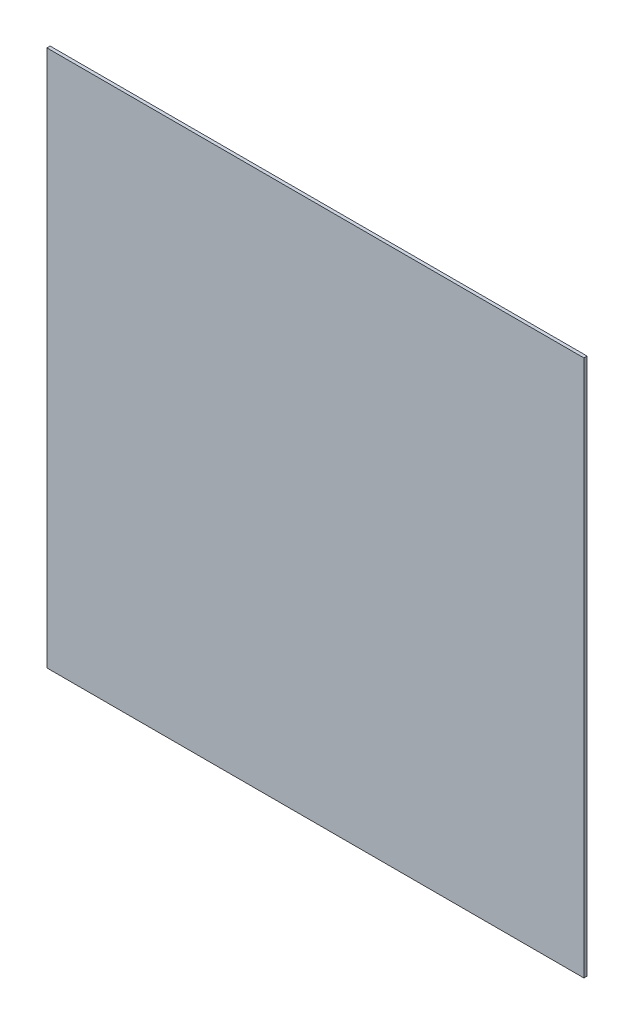
ISO-10303-21;
HEADER;
FILE_DESCRIPTION(('STEP AP214'),'2;1');
FILE_NAME('part.step','',(''),(''),'','','');
FILE_SCHEMA(('AUTOMOTIVE_DESIGN { 1 0 10303 214 1 1 1 1 }'));
ENDSEC;
DATA;
#1=APPLICATION_CONTEXT('core data for automotive mechanical design processes');
#2=APPLICATION_PROTOCOL_DEFINITION('international standard','automotive_design',2000,#1);
#3=PRODUCT_CONTEXT('',#1,'mechanical');
#4=PRODUCT('Part','Part','',(#3));
#5=PRODUCT_RELATED_PRODUCT_CATEGORY('part','',(#4));
#6=PRODUCT_DEFINITION_FORMATION('','',#4);
#7=PRODUCT_DEFINITION_CONTEXT('part definition',#1,'design');
#8=PRODUCT_DEFINITION('design','',#6,#7);
#9=PRODUCT_DEFINITION_SHAPE('','',#8);
#10=(LENGTH_UNIT() NAMED_UNIT(*) SI_UNIT(.MILLI.,.METRE.));
#11=(NAMED_UNIT(*) PLANE_ANGLE_UNIT() SI_UNIT($,.RADIAN.));
#12=(NAMED_UNIT(*) SI_UNIT($,.STERADIAN.) SOLID_ANGLE_UNIT());
#13=UNCERTAINTY_MEASURE_WITH_UNIT(LENGTH_MEASURE(1.E-05),#10,'distance_accuracy_value','');
#14=(GEOMETRIC_REPRESENTATION_CONTEXT(3) GLOBAL_UNCERTAINTY_ASSIGNED_CONTEXT((#13)) GLOBAL_UNIT_ASSIGNED_CONTEXT((#10,
#11,#12)) REPRESENTATION_CONTEXT('',''));
#15=CARTESIAN_POINT('',(0.,0.,0.));
#16=DIRECTION('',(0.,0.,1.));
#17=DIRECTION('',(1.,0.,0.));
#18=AXIS2_PLACEMENT_3D('',#15,#16,#17);
#19=CARTESIAN_POINT('',(0.,0.,0.762));
#20=DIRECTION('',(1.,0.,0.));
#21=DIRECTION('',(0.,0.,-1.));
#22=AXIS2_PLACEMENT_3D('',#19,#20,#21);
#23=PLANE('',#22);
#24=DIRECTION('',(0.,-1.,0.));
#25=VECTOR('',#24,1.);
#26=CARTESIAN_POINT('',(0.,0.,0.));
#27=LINE('',#26,#25);
#28=CARTESIAN_POINT('',(0.,127.,0.));
#29=VERTEX_POINT('',#28);
#30=CARTESIAN_POINT('',(0.,0.,0.));
#31=VERTEX_POINT('',#30);
#32=EDGE_CURVE('E113',#29,#31,#27,.T.);
#33=ORIENTED_EDGE('',*,*,#32,.T.);
#34=DIRECTION('',(0.,0.,-1.));
#35=VECTOR('',#34,1.);
#36=CARTESIAN_POINT('',(0.,0.,0.762));
#37=LINE('',#36,#35);
#38=CARTESIAN_POINT('',(0.,0.,0.762));
#39=VERTEX_POINT('',#38);
#40=EDGE_CURVE('E11',#39,#31,#37,.T.);
#41=ORIENTED_EDGE('',*,*,#40,.F.);
#42=DIRECTION('',(0.,-1.,0.));
#43=VECTOR('',#42,1.);
#44=CARTESIAN_POINT('',(0.,0.,0.762));
#45=LINE('',#44,#43);
#46=CARTESIAN_POINT('',(0.,127.,0.762));
#47=VERTEX_POINT('',#46);
#48=EDGE_CURVE('E97',#47,#39,#45,.T.);
#49=ORIENTED_EDGE('',*,*,#48,.F.);
#50=DIRECTION('',(0.,0.,-1.));
#51=VECTOR('',#50,1.);
#52=CARTESIAN_POINT('',(0.,127.,0.762));
#53=LINE('',#52,#51);
#54=EDGE_CURVE('E109',#47,#29,#53,.T.);
#55=ORIENTED_EDGE('',*,*,#54,.T.);
#56=EDGE_LOOP('',(#33,#41,#49,#55));
#57=FACE_BOUND('',#56,.T.);
#58=ADVANCED_FACE('F45',(#57),#23,.F.);
#59=CARTESIAN_POINT('',(0.,0.,0.762));
#60=DIRECTION('',(0.,1.,0.));
#61=DIRECTION('',(0.,0.,1.));
#62=AXIS2_PLACEMENT_3D('',#59,#60,#61);
#63=PLANE('',#62);
#64=DIRECTION('',(1.,0.,0.));
#65=VECTOR('',#64,1.);
#66=CARTESIAN_POINT('',(0.,0.,0.));
#67=LINE('',#66,#65);
#68=CARTESIAN_POINT('',(127.,0.,0.));
#69=VERTEX_POINT('',#68);
#70=EDGE_CURVE('E102',#31,#69,#67,.T.);
#71=ORIENTED_EDGE('',*,*,#70,.T.);
#72=DIRECTION('',(0.,0.,-1.));
#73=VECTOR('',#72,1.);
#74=CARTESIAN_POINT('',(127.,0.,0.762));
#75=LINE('',#74,#73);
#76=CARTESIAN_POINT('',(127.,0.,0.762));
#77=VERTEX_POINT('',#76);
#78=EDGE_CURVE('E54',#77,#69,#75,.T.);
#79=ORIENTED_EDGE('',*,*,#78,.F.);
#80=DIRECTION('',(1.,0.,0.));
#81=VECTOR('',#80,1.);
#82=CARTESIAN_POINT('',(0.,0.,0.762));
#83=LINE('',#82,#81);
#84=EDGE_CURVE('E92',#39,#77,#83,.T.);
#85=ORIENTED_EDGE('',*,*,#84,.F.);
#86=ORIENTED_EDGE('',*,*,#40,.T.);
#87=EDGE_LOOP('',(#71,#79,#85,#86));
#88=FACE_BOUND('',#87,.T.);
#89=ADVANCED_FACE('F101',(#88),#63,.F.);
#90=CARTESIAN_POINT('',(127.,0.,0.762));
#91=DIRECTION('',(-1.,0.,0.));
#92=DIRECTION('',(0.,0.,1.));
#93=AXIS2_PLACEMENT_3D('',#90,#91,#92);
#94=PLANE('',#93);
#95=DIRECTION('',(0.,1.,0.));
#96=VECTOR('',#95,1.);
#97=CARTESIAN_POINT('',(127.,0.,0.));
#98=LINE('',#97,#96);
#99=CARTESIAN_POINT('',(127.,127.,0.));
#100=VERTEX_POINT('',#99);
#101=EDGE_CURVE('E79',#69,#100,#98,.T.);
#102=ORIENTED_EDGE('',*,*,#101,.T.);
#103=DIRECTION('',(0.,0.,-1.));
#104=VECTOR('',#103,1.);
#105=CARTESIAN_POINT('',(127.,127.,0.762));
#106=LINE('',#105,#104);
#107=CARTESIAN_POINT('',(127.,127.,0.762));
#108=VERTEX_POINT('',#107);
#109=EDGE_CURVE('E104',#108,#100,#106,.T.);
#110=ORIENTED_EDGE('',*,*,#109,.F.);
#111=DIRECTION('',(0.,1.,0.));
#112=VECTOR('',#111,1.);
#113=CARTESIAN_POINT('',(127.,0.,0.762));
#114=LINE('',#113,#112);
#115=EDGE_CURVE('E95',#77,#108,#114,.T.);
#116=ORIENTED_EDGE('',*,*,#115,.F.);
#117=ORIENTED_EDGE('',*,*,#78,.T.);
#118=EDGE_LOOP('',(#102,#110,#116,#117));
#119=FACE_BOUND('',#118,.T.);
#120=ADVANCED_FACE('F105',(#119),#94,.F.);
#121=CARTESIAN_POINT('',(0.,127.,0.762));
#122=DIRECTION('',(0.,-1.,0.));
#123=DIRECTION('',(0.,0.,-1.));
#124=AXIS2_PLACEMENT_3D('',#121,#122,#123);
#125=PLANE('',#124);
#126=DIRECTION('',(-1.,0.,0.));
#127=VECTOR('',#126,1.);
#128=CARTESIAN_POINT('',(0.,127.,0.));
#129=LINE('',#128,#127);
#130=EDGE_CURVE('E85',#100,#29,#129,.T.);
#131=ORIENTED_EDGE('',*,*,#130,.T.);
#132=ORIENTED_EDGE('',*,*,#54,.F.);
#133=DIRECTION('',(-1.,0.,0.));
#134=VECTOR('',#133,1.);
#135=CARTESIAN_POINT('',(0.,127.,0.762));
#136=LINE('',#135,#134);
#137=EDGE_CURVE('E62',#108,#47,#136,.T.);
#138=ORIENTED_EDGE('',*,*,#137,.F.);
#139=ORIENTED_EDGE('',*,*,#109,.T.);
#140=EDGE_LOOP('',(#131,#132,#138,#139));
#141=FACE_BOUND('',#140,.T.);
#142=ADVANCED_FACE('F126',(#141),#125,.F.);
#143=CARTESIAN_POINT('',(0.,0.,0.762));
#144=DIRECTION('',(0.,0.,-1.));
#145=DIRECTION('',(-1.,0.,0.));
#146=AXIS2_PLACEMENT_3D('',#143,#144,#145);
#147=PLANE('',#146);
#148=ORIENTED_EDGE('',*,*,#48,.T.);
#149=ORIENTED_EDGE('',*,*,#84,.T.);
#150=ORIENTED_EDGE('',*,*,#115,.T.);
#151=ORIENTED_EDGE('',*,*,#137,.T.);
#152=EDGE_LOOP('',(#148,#149,#150,#151));
#153=FACE_BOUND('',#152,.T.);
#154=ADVANCED_FACE('F93',(#153),#147,.F.);
#155=CARTESIAN_POINT('',(0.,0.,0.));
#156=DIRECTION('',(0.,0.,-1.));
#157=DIRECTION('',(-1.,0.,0.));
#158=AXIS2_PLACEMENT_3D('',#155,#156,#157);
#159=PLANE('',#158);
#160=ORIENTED_EDGE('',*,*,#32,.F.);
#161=ORIENTED_EDGE('',*,*,#130,.F.);
#162=ORIENTED_EDGE('',*,*,#101,.F.);
#163=ORIENTED_EDGE('',*,*,#70,.F.);
#164=EDGE_LOOP('',(#160,#161,#162,#163));
#165=FACE_BOUND('',#164,.T.);
#166=ADVANCED_FACE('F129',(#165),#159,.T.);
#167=CLOSED_SHELL('',(#58,#89,#120,#142,#154,#166));
#168=MANIFOLD_SOLID_BREP('B2',#167);
#169=ADVANCED_BREP_SHAPE_REPRESENTATION('',(#18,#168),#14);
#170=SHAPE_DEFINITION_REPRESENTATION(#9,#169);
ENDSEC;
END-ISO-10303-21;
